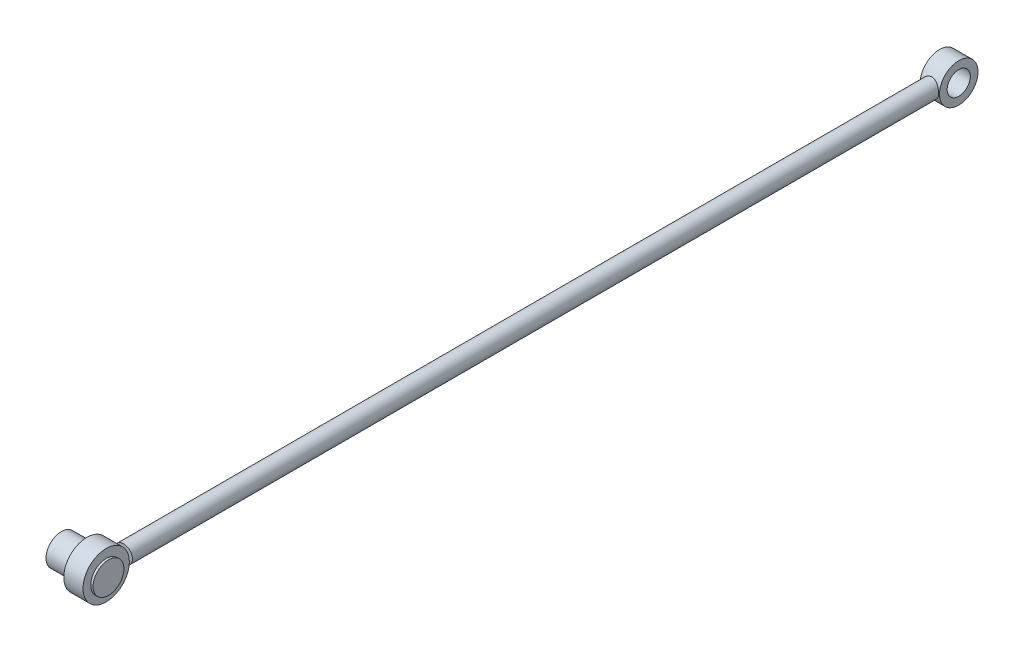
ISO-10303-21;
HEADER;
FILE_DESCRIPTION(('STEP AP214'),'2;1');
FILE_NAME('part.step','',(''),(''),'','','');
FILE_SCHEMA(('AUTOMOTIVE_DESIGN { 1 0 10303 214 1 1 1 1 }'));
ENDSEC;
DATA;
#1=APPLICATION_CONTEXT('core data for automotive mechanical design processes');
#2=APPLICATION_PROTOCOL_DEFINITION('international standard','automotive_design',2000,#1);
#3=PRODUCT_CONTEXT('',#1,'mechanical');
#4=PRODUCT('Part','Part','',(#3));
#5=PRODUCT_RELATED_PRODUCT_CATEGORY('part','',(#4));
#6=PRODUCT_DEFINITION_FORMATION('','',#4);
#7=PRODUCT_DEFINITION_CONTEXT('part definition',#1,'design');
#8=PRODUCT_DEFINITION('design','',#6,#7);
#9=PRODUCT_DEFINITION_SHAPE('','',#8);
#10=(LENGTH_UNIT() NAMED_UNIT(*) SI_UNIT(.MILLI.,.METRE.));
#11=(NAMED_UNIT(*) PLANE_ANGLE_UNIT() SI_UNIT($,.RADIAN.));
#12=(NAMED_UNIT(*) SI_UNIT($,.STERADIAN.) SOLID_ANGLE_UNIT());
#13=UNCERTAINTY_MEASURE_WITH_UNIT(LENGTH_MEASURE(1.E-05),#10,'distance_accuracy_value','');
#14=(GEOMETRIC_REPRESENTATION_CONTEXT(3) GLOBAL_UNCERTAINTY_ASSIGNED_CONTEXT((#13)) GLOBAL_UNIT_ASSIGNED_CONTEXT((#10,
#11,#12)) REPRESENTATION_CONTEXT('',''));
#15=CARTESIAN_POINT('',(0.,0.,0.));
#16=DIRECTION('',(0.,0.,1.));
#17=DIRECTION('',(1.,0.,0.));
#18=AXIS2_PLACEMENT_3D('',#15,#16,#17);
#19=CARTESIAN_POINT('',(1.24999999999999,0.,0.));
#20=DIRECTION('',(1.,0.,0.));
#21=DIRECTION('',(0.,0.,-1.));
#22=AXIS2_PLACEMENT_3D('',#19,#20,#21);
#23=PLANE('',#22);
#24=CARTESIAN_POINT('',(1.24999999999999,-0.128144949894505,56.));
#25=DIRECTION('',(1.,0.,0.));
#26=DIRECTION('',(0.,0.,-1.));
#27=AXIS2_PLACEMENT_3D('',#24,#25,#26);
#28=CIRCLE('',#27,2.);
#29=CARTESIAN_POINT('',(1.24999999999999,-0.128144949894505,54.));
#30=VERTEX_POINT('',#29);
#31=EDGE_CURVE('E13',#30,#30,#28,.T.);
#32=ORIENTED_EDGE('',*,*,#31,.F.);
#33=EDGE_LOOP('',(#32));
#34=FACE_BOUND('',#33,.T.);
#35=CARTESIAN_POINT('',(1.24999999999999,0.,56.));
#36=DIRECTION('',(-1.,0.,0.));
#37=DIRECTION('',(0.,0.,1.));
#38=AXIS2_PLACEMENT_3D('',#35,#36,#37);
#39=CIRCLE('',#38,3.);
#40=CARTESIAN_POINT('',(1.24999999999999,0.,59.));
#41=VERTEX_POINT('',#40);
#42=EDGE_CURVE('E64',#41,#41,#39,.T.);
#43=ORIENTED_EDGE('',*,*,#42,.F.);
#44=EDGE_LOOP('',(#43));
#45=FACE_BOUND('',#44,.T.);
#46=ADVANCED_FACE('F61',(#34,#45),#23,.T.);
#47=CARTESIAN_POINT('',(-1.25000000000001,0.,56.));
#48=DIRECTION('',(-1.,0.,0.));
#49=DIRECTION('',(0.,0.,1.));
#50=AXIS2_PLACEMENT_3D('',#47,#48,#49);
#51=CYLINDRICAL_SURFACE('',#50,3.);
#52=ORIENTED_EDGE('',*,*,#42,.T.);
#53=EDGE_LOOP('',(#52));
#54=FACE_BOUND('',#53,.T.);
#55=CARTESIAN_POINT('',(-1.25000000000001,0.,56.));
#56=DIRECTION('',(-1.,0.,0.));
#57=DIRECTION('',(0.,0.,1.));
#58=AXIS2_PLACEMENT_3D('',#55,#56,#57);
#59=CIRCLE('',#58,3.);
#60=CARTESIAN_POINT('',(-1.25000000000001,0.,59.));
#61=VERTEX_POINT('',#60);
#62=EDGE_CURVE('E79',#61,#61,#59,.T.);
#63=ORIENTED_EDGE('',*,*,#62,.F.);
#64=EDGE_LOOP('',(#63));
#65=FACE_BOUND('',#64,.T.);
#66=ADVANCED_FACE('F86',(#54,#65),#51,.T.);
#67=CARTESIAN_POINT('',(-1.25000000000001,0.,0.));
#68=DIRECTION('',(1.,0.,0.));
#69=DIRECTION('',(0.,0.,-1.));
#70=AXIS2_PLACEMENT_3D('',#67,#68,#69);
#71=PLANE('',#70);
#72=CARTESIAN_POINT('',(-1.25000000000001,0.,56.));
#73=DIRECTION('',(-1.,0.,0.));
#74=DIRECTION('',(0.,0.,1.));
#75=AXIS2_PLACEMENT_3D('',#72,#73,#74);
#76=CIRCLE('',#75,2.);
#77=CARTESIAN_POINT('',(-1.25000000000001,0.,58.));
#78=VERTEX_POINT('',#77);
#79=EDGE_CURVE('E68',#78,#78,#76,.T.);
#80=ORIENTED_EDGE('',*,*,#79,.F.);
#81=EDGE_LOOP('',(#80));
#82=FACE_BOUND('',#81,.T.);
#83=ORIENTED_EDGE('',*,*,#62,.T.);
#84=EDGE_LOOP('',(#83));
#85=FACE_BOUND('',#84,.T.);
#86=ADVANCED_FACE('F96',(#82,#85),#71,.F.);
#87=CARTESIAN_POINT('',(-4.55000000000001,0.,56.));
#88=DIRECTION('',(1.,0.,0.));
#89=DIRECTION('',(0.,0.,-1.));
#90=AXIS2_PLACEMENT_3D('',#87,#88,#89);
#91=CYLINDRICAL_SURFACE('',#90,2.);
#92=CARTESIAN_POINT('',(-4.55000000000001,0.,56.));
#93=DIRECTION('',(-1.,0.,0.));
#94=DIRECTION('',(0.,0.,1.));
#95=AXIS2_PLACEMENT_3D('',#92,#93,#94);
#96=CIRCLE('',#95,2.);
#97=CARTESIAN_POINT('',(-4.55000000000001,0.,58.));
#98=VERTEX_POINT('',#97);
#99=EDGE_CURVE('E77',#98,#98,#96,.T.);
#100=ORIENTED_EDGE('',*,*,#99,.F.);
#101=EDGE_LOOP('',(#100));
#102=FACE_BOUND('',#101,.T.);
#103=ORIENTED_EDGE('',*,*,#79,.T.);
#104=EDGE_LOOP('',(#103));
#105=FACE_BOUND('',#104,.T.);
#106=ADVANCED_FACE('F100',(#102,#105),#91,.T.);
#107=CARTESIAN_POINT('',(-4.55000000000001,0.,56.));
#108=DIRECTION('',(-1.,0.,0.));
#109=DIRECTION('',(0.,0.,1.));
#110=AXIS2_PLACEMENT_3D('',#107,#108,#109);
#111=PLANE('',#110);
#112=ORIENTED_EDGE('',*,*,#99,.T.);
#113=EDGE_LOOP('',(#112));
#114=FACE_BOUND('',#113,.T.);
#115=ADVANCED_FACE('F106',(#114),#111,.T.);
#116=CARTESIAN_POINT('',(1.54999999999999,-0.128144949894505,56.));
#117=DIRECTION('',(-1.,0.,0.));
#118=DIRECTION('',(0.,0.,1.));
#119=AXIS2_PLACEMENT_3D('',#116,#117,#118);
#120=CYLINDRICAL_SURFACE('',#119,2.);
#121=CARTESIAN_POINT('',(1.54999999999999,-0.128144949894505,56.));
#122=DIRECTION('',(1.,0.,0.));
#123=DIRECTION('',(0.,0.,-1.));
#124=AXIS2_PLACEMENT_3D('',#121,#122,#123);
#125=CIRCLE('',#124,2.);
#126=CARTESIAN_POINT('',(1.54999999999999,-0.128144949894505,54.));
#127=VERTEX_POINT('',#126);
#128=EDGE_CURVE('E76',#127,#127,#125,.T.);
#129=ORIENTED_EDGE('',*,*,#128,.F.);
#130=EDGE_LOOP('',(#129));
#131=FACE_BOUND('',#130,.T.);
#132=ORIENTED_EDGE('',*,*,#31,.T.);
#133=EDGE_LOOP('',(#132));
#134=FACE_BOUND('',#133,.T.);
#135=ADVANCED_FACE('F109',(#131,#134),#120,.T.);
#136=CARTESIAN_POINT('',(1.54999999999999,-0.128144949894505,56.));
#137=DIRECTION('',(1.,0.,0.));
#138=DIRECTION('',(0.,0.,-1.));
#139=AXIS2_PLACEMENT_3D('',#136,#137,#138);
#140=PLANE('',#139);
#141=ORIENTED_EDGE('',*,*,#128,.T.);
#142=EDGE_LOOP('',(#141));
#143=FACE_BOUND('',#142,.T.);
#144=ADVANCED_FACE('F112',(#143),#140,.T.);
#145=CLOSED_SHELL('',(#46,#66,#86,#106,#115,#135,#144));
#146=MANIFOLD_SOLID_BREP('B2',#145);
#147=CARTESIAN_POINT('',(-2.67659003472271,0.,-54.5));
#148=DIRECTION('',(-1.,0.,0.));
#149=DIRECTION('',(0.,0.,1.));
#150=AXIS2_PLACEMENT_3D('',#147,#148,#149);
#151=CYLINDRICAL_SURFACE('',#150,2.5);
#152=CARTESIAN_POINT('',(1.24999999999999,0.,-54.5));
#153=DIRECTION('',(-1.,0.,0.));
#154=DIRECTION('',(0.,0.,1.));
#155=AXIS2_PLACEMENT_3D('',#152,#153,#154);
#156=CIRCLE('',#155,2.5);
#157=CARTESIAN_POINT('',(1.24999999999999,0.,-52.));
#158=VERTEX_POINT('',#157);
#159=EDGE_CURVE('E188',#158,#158,#156,.T.);
#160=ORIENTED_EDGE('',*,*,#159,.T.);
#161=EDGE_LOOP('',(#160));
#162=FACE_BOUND('',#161,.T.);
#163=CARTESIAN_POINT('',(-1.25000000000001,0.,-54.5));
#164=DIRECTION('',(-1.,0.,0.));
#165=DIRECTION('',(0.,0.,1.));
#166=AXIS2_PLACEMENT_3D('',#163,#164,#165);
#167=CIRCLE('',#166,2.5);
#168=CARTESIAN_POINT('',(-1.25000000000001,0.,-52.));
#169=VERTEX_POINT('',#168);
#170=EDGE_CURVE('E184',#169,#169,#167,.T.);
#171=ORIENTED_EDGE('',*,*,#170,.F.);
#172=EDGE_LOOP('',(#171));
#173=FACE_BOUND('',#172,.T.);
#174=CARTESIAN_POINT('',(-1.15,0.,-52.));
#175=CARTESIAN_POINT('',(-1.14999680085672,-0.0610221164421327,-52.000002666765));
#176=CARTESIAN_POINT('',(-1.14511438468194,-0.122133602234696,-52.0022589365363));
#177=CARTESIAN_POINT('',(-1.12578408759951,-0.242585724274824,-52.0110608165383));
#178=CARTESIAN_POINT('',(-1.1113144593065,-0.30192201313999,-52.0176161783731));
#179=CARTESIAN_POINT('',(-1.07347537258062,-0.416891902761806,-52.0343229289961));
#180=CARTESIAN_POINT('',(-1.0501385142006,-0.472538199826034,-52.0444611361487));
#181=CARTESIAN_POINT('',(-0.995379061951152,-0.579059558054782,-52.0673753892748));
#182=CARTESIAN_POINT('',(-0.963957969743383,-0.629935502929074,-52.0801509452689));
#183=CARTESIAN_POINT('',(-0.891992942753149,-0.728540239687653,-52.1079314703465));
#184=CARTESIAN_POINT('',(-0.851050642634139,-0.775954698633466,-52.1230191803576));
#185=CARTESIAN_POINT('',(-0.762053881626836,-0.863525035277654,-52.1534115963217));
#186=CARTESIAN_POINT('',(-0.713994910902616,-0.903676274164433,-52.168716434267));
#187=CARTESIAN_POINT('',(-0.608482683618005,-0.978096362346193,-52.1989042682043));
#188=CARTESIAN_POINT('',(-0.550628623653581,-1.0118362114668,-52.2137001474002));
#189=CARTESIAN_POINT('',(-0.429298304202954,-1.06896729306594,-52.2398444458014));
#190=CARTESIAN_POINT('',(-0.36582557224461,-1.09236496405849,-52.2511950085024));
#191=CARTESIAN_POINT('',(-0.238659144977491,-1.12678178567324,-52.2682482909705));
#192=CARTESIAN_POINT('',(-0.175168948475132,-1.13841007873844,-52.2742269036183));
#193=CARTESIAN_POINT('',(-0.0468794048390744,-1.15084625008846,-52.2806290657944));
#194=CARTESIAN_POINT('',(0.0179189321620603,-1.15166217987055,-52.2810567488538));
#195=CARTESIAN_POINT('',(0.140230440873755,-1.14290244196327,-52.2765368058895));
#196=CARTESIAN_POINT('',(0.197838904365184,-1.13433032528635,-52.272108238025));
#197=CARTESIAN_POINT('',(0.310684166786622,-1.10874887233228,-52.2592682914526));
#198=CARTESIAN_POINT('',(0.365920376996089,-1.09173745467631,-52.2508559302478));
#199=CARTESIAN_POINT('',(0.473975212565101,-1.04942513434305,-52.230801135829));
#200=CARTESIAN_POINT('',(0.526709456981898,-1.02394324474928,-52.2190891156949));
#201=CARTESIAN_POINT('',(0.627385660423913,-0.965545247982676,-52.1937619292328));
#202=CARTESIAN_POINT('',(0.675325532416868,-0.932625923375899,-52.1801459402223));
#203=CARTESIAN_POINT('',(0.770358902789346,-0.856237788024085,-52.1508089023228));
#204=CARTESIAN_POINT('',(0.816833394112794,-0.812023684477652,-52.1350170492808));
#205=CARTESIAN_POINT('',(0.90194133687937,-0.716313132069732,-52.1042911338125));
#206=CARTESIAN_POINT('',(0.940572075234533,-0.664814173853318,-52.0893573694681));
#207=CARTESIAN_POINT('',(1.01008908112145,-0.553761033938336,-52.0614078739643));
#208=CARTESIAN_POINT('',(1.04067045248726,-0.493993862575749,-52.0484737505294));
#209=CARTESIAN_POINT('',(1.09111856945803,-0.369415412363431,-52.0266379827281));
#210=CARTESIAN_POINT('',(1.11099255236712,-0.304607574576102,-52.0177336152349));
#211=CARTESIAN_POINT('',(1.13804370241597,-0.176911532685541,-52.0055040783636));
#212=CARTESIAN_POINT('',(1.14604816002009,-0.11423346499986,-52.0018163130541));
#213=CARTESIAN_POINT('',(1.15166415718688,0.0116756267784259,-51.999235608212));
#214=CARTESIAN_POINT('',(1.14927957245369,0.0749064358829793,-52.0003408806026));
#215=CARTESIAN_POINT('',(1.13472588854476,0.195896660750884,-52.0069964663412));
#216=CARTESIAN_POINT('',(1.12318473531876,0.253749299539136,-52.0122614201795));
#217=CARTESIAN_POINT('',(1.09157436461664,0.366607154128703,-52.0263720471876));
#218=CARTESIAN_POINT('',(1.0715041371748,0.421612031848305,-52.0352181444107));
#219=CARTESIAN_POINT('',(1.02278667428463,0.529150457858727,-52.0560087289794));
#220=CARTESIAN_POINT('',(0.993893746764701,0.581555262231183,-52.0680404496421));
#221=CARTESIAN_POINT('',(0.928619088747682,0.680959846725025,-52.0939790208981));
#222=CARTESIAN_POINT('',(0.892234068420063,0.727957238233888,-52.107886694307));
#223=CARTESIAN_POINT('',(0.809386059775389,0.81946466792808,-52.137589033572));
#224=CARTESIAN_POINT('',(0.762326755580171,0.863416742649005,-52.1534432875488));
#225=CARTESIAN_POINT('',(0.661344100404595,0.94300549353514,-52.184278437436));
#226=CARTESIAN_POINT('',(0.60741775412467,0.978638521725544,-52.1992589480504));
#227=CARTESIAN_POINT('',(0.492126592699997,1.04151139957948,-52.2270122089294));
#228=CARTESIAN_POINT('',(0.43058885067794,1.06847160006055,-52.2397064868555));
#229=CARTESIAN_POINT('',(0.303070653636758,1.11137787962301,-52.2604872701905));
#230=CARTESIAN_POINT('',(0.237095026927362,1.12733572289275,-52.2685786955403));
#231=CARTESIAN_POINT('',(0.108863094637529,1.14650438487335,-52.2783715440814));
#232=CARTESIAN_POINT('',(0.0467953894374937,1.15071960292076,-52.2805757446969));
#233=CARTESIAN_POINT('',(-0.0771622096268085,1.14907992262834,-52.2797258261694));
#234=CARTESIAN_POINT('',(-0.139052145279863,1.14322762520174,-52.276673065147));
#235=CARTESIAN_POINT('',(-0.256447839565854,1.12251663487283,-52.2661524208123));
#236=CARTESIAN_POINT('',(-0.312099663521724,1.10830626448546,-52.259003231416));
#237=CARTESIAN_POINT('',(-0.420209118905766,1.07199734932819,-52.2414105486326));
#238=CARTESIAN_POINT('',(-0.472665803150068,1.04989647865171,-52.2309660839929));
#239=CARTESIAN_POINT('',(-0.57668011844881,0.99678060130044,-52.2071137104099));
#240=CARTESIAN_POINT('',(-0.627952240665216,0.965275324597976,-52.1935561840935));
#241=CARTESIAN_POINT('',(-0.724792057417062,0.894854473756866,-52.1653321891056));
#242=CARTESIAN_POINT('',(-0.770357151995548,0.855935542377582,-52.1506652198492));
#243=CARTESIAN_POINT('',(-0.859035182081372,0.767367732153718,-52.1201800559744));
#244=CARTESIAN_POINT('',(-0.901488483932116,0.717046212748816,-52.1043871545817));
#245=CARTESIAN_POINT('',(-0.977439136512883,0.609464622140747,-52.0747862560356));
#246=CARTESIAN_POINT('',(-1.01093229398904,0.552201320408678,-52.0609791896249));
#247=CARTESIAN_POINT('',(-1.06757523739849,0.432586304184508,-52.0369606782327));
#248=CARTESIAN_POINT('',(-1.0907988596119,0.370274855525814,-52.0267236815512));
#249=CARTESIAN_POINT('',(-1.12617254126555,0.242128552488221,-52.0109218140429));
#250=CARTESIAN_POINT('',(-1.13835581437739,0.176304901150819,-52.0053429337948));
#251=CARTESIAN_POINT('',(-1.14648888595882,0.0916645825875702,-52.0016132160943));
#252=CARTESIAN_POINT('',(-1.14780418805331,0.0733641271700347,-52.0010094154064));
#253=CARTESIAN_POINT('',(-1.14956023398603,0.0367118118168692,-52.0002024026786));
#254=CARTESIAN_POINT('',(-1.15000096253813,0.0183599509883696,-51.9999991976405));
#255=CARTESIAN_POINT('',(-1.15,0.,-52.));
#256=B_SPLINE_CURVE_WITH_KNOTS('',3,(#174,#175,#176,#177,#178,#179,#180,#181,#182,#183,#184,
#185,#186,#187,#188,#189,#190,#191,#192,#193,#194,#195,#196,#197,#198,#199,#200,#201,#202,#203,
#204,#205,#206,#207,#208,#209,#210,#211,#212,#213,#214,#215,#216,#217,#218,#219,#220,#221,#222,
#223,#224,#225,#226,#227,#228,#229,#230,#231,#232,#233,#234,#235,#236,#237,#238,#239,#240,#241,
#242,#243,#244,#245,#246,#247,#248,#249,#250,#251,#252,#253,#254,#255),.UNSPECIFIED.,.T.,.F.,(4,
2,2,2,2,2,2,2,2,2,2,2,2,2,2,2,2,2,2,2,2,2,2,2,2,2,2,2,2,2,2,2,2,2,2,2,2,2,2,2,4),(0.,
0.182991184318566,0.366398888774783,0.549138725346493,0.731844642124993,0.92433256701881,
1.11694299773464,1.32167114547342,1.52627165975279,1.71963788525092,1.91286011122177,
2.08727854371261,2.26174001429955,2.44019847999677,2.61873429514118,2.81604254018051,
3.01341891665008,3.21744754373153,3.4213380908622,3.61021266528953,3.79901678478451,
3.97588773452364,4.15277963417946,4.33513329320142,4.51756719640664,4.7156292021259,
4.91377789731998,5.11779162152826,5.32158686586735,5.5073200700012,5.69300529770972,
5.865896817358,6.03883934289628,6.22314446515028,6.40753324843077,6.60969400762341,
6.81194921108578,7.01272560105066,7.21289595261076,7.26795222811409,7.32300946590391),.UNSPECIFIED.);
#257=CARTESIAN_POINT('',(-1.15,0.,-52.));
#258=VERTEX_POINT('',#257);
#259=EDGE_CURVE('E173',#258,#258,#256,.T.);
#260=ORIENTED_EDGE('',*,*,#259,.F.);
#261=EDGE_LOOP('',(#260));
#262=FACE_BOUND('',#261,.T.);
#263=ADVANCED_FACE('F168',(#162,#173,#262),#151,.T.);
#264=CARTESIAN_POINT('',(-1.25000000000001,0.,-53.));
#265=DIRECTION('',(-1.,0.,0.));
#266=DIRECTION('',(0.,0.,1.));
#267=AXIS2_PLACEMENT_3D('',#264,#265,#266);
#268=PLANE('',#267);
#269=ORIENTED_EDGE('',*,*,#170,.T.);
#270=EDGE_LOOP('',(#269));
#271=FACE_BOUND('',#270,.T.);
#272=CARTESIAN_POINT('',(-1.25000000000001,0.,-54.5));
#273=DIRECTION('',(-1.,0.,0.));
#274=DIRECTION('',(0.,0.,1.));
#275=AXIS2_PLACEMENT_3D('',#272,#273,#274);
#276=CIRCLE('',#275,1.5);
#277=CARTESIAN_POINT('',(-1.25000000000001,0.,-53.));
#278=VERTEX_POINT('',#277);
#279=EDGE_CURVE('E194',#278,#278,#276,.T.);
#280=ORIENTED_EDGE('',*,*,#279,.F.);
#281=EDGE_LOOP('',(#280));
#282=FACE_BOUND('',#281,.T.);
#283=ADVANCED_FACE('F201',(#271,#282),#268,.T.);
#284=CARTESIAN_POINT('',(1.24999999999999,0.,-53.));
#285=DIRECTION('',(1.,0.,0.));
#286=DIRECTION('',(0.,0.,-1.));
#287=AXIS2_PLACEMENT_3D('',#284,#285,#286);
#288=PLANE('',#287);
#289=CARTESIAN_POINT('',(1.24999999999999,0.,-54.5));
#290=DIRECTION('',(-1.,0.,0.));
#291=DIRECTION('',(0.,0.,1.));
#292=AXIS2_PLACEMENT_3D('',#289,#290,#291);
#293=CIRCLE('',#292,1.5);
#294=CARTESIAN_POINT('',(1.24999999999999,0.,-53.));
#295=VERTEX_POINT('',#294);
#296=EDGE_CURVE('E191',#295,#295,#293,.T.);
#297=ORIENTED_EDGE('',*,*,#296,.T.);
#298=EDGE_LOOP('',(#297));
#299=FACE_BOUND('',#298,.T.);
#300=ORIENTED_EDGE('',*,*,#159,.F.);
#301=EDGE_LOOP('',(#300));
#302=FACE_BOUND('',#301,.T.);
#303=ADVANCED_FACE('F203',(#299,#302),#288,.T.);
#304=CARTESIAN_POINT('',(-2.67659003472271,0.,-54.5));
#305=DIRECTION('',(-1.,0.,0.));
#306=DIRECTION('',(0.,0.,1.));
#307=AXIS2_PLACEMENT_3D('',#304,#305,#306);
#308=CYLINDRICAL_SURFACE('',#307,1.5);
#309=ORIENTED_EDGE('',*,*,#279,.T.);
#310=EDGE_LOOP('',(#309));
#311=FACE_BOUND('',#310,.T.);
#312=ORIENTED_EDGE('',*,*,#296,.F.);
#313=EDGE_LOOP('',(#312));
#314=FACE_BOUND('',#313,.T.);
#315=ADVANCED_FACE('F198',(#311,#314),#308,.F.);
#316=CARTESIAN_POINT('',(0.,0.,52.5));
#317=DIRECTION('',(0.,0.,-1.));
#318=DIRECTION('',(-1.,0.,0.));
#319=AXIS2_PLACEMENT_3D('',#316,#317,#318);
#320=CYLINDRICAL_SURFACE('',#319,1.15);
#321=ORIENTED_EDGE('',*,*,#259,.T.);
#322=EDGE_LOOP('',(#321));
#323=FACE_BOUND('',#322,.T.);
#324=CARTESIAN_POINT('',(0.,0.,52.5));
#325=DIRECTION('',(0.,0.,1.));
#326=DIRECTION('',(1.,0.,0.));
#327=AXIS2_PLACEMENT_3D('',#324,#325,#326);
#328=CIRCLE('',#327,1.15);
#329=CARTESIAN_POINT('',(1.15,0.,52.5));
#330=VERTEX_POINT('',#329);
#331=EDGE_CURVE('E60',#330,#330,#328,.T.);
#332=ORIENTED_EDGE('',*,*,#331,.F.);
#333=EDGE_LOOP('',(#332));
#334=FACE_BOUND('',#333,.T.);
#335=ADVANCED_FACE('F170',(#323,#334),#320,.T.);
#336=CARTESIAN_POINT('',(0.,0.,52.5));
#337=DIRECTION('',(0.,0.,1.));
#338=DIRECTION('',(1.,0.,0.));
#339=AXIS2_PLACEMENT_3D('',#336,#337,#338);
#340=PLANE('',#339);
#341=ORIENTED_EDGE('',*,*,#331,.T.);
#342=EDGE_LOOP('',(#341));
#343=FACE_BOUND('',#342,.T.);
#344=ADVANCED_FACE('F214',(#343),#340,.T.);
#345=CLOSED_SHELL('',(#263,#283,#303,#315,#335,#344));
#346=MANIFOLD_SOLID_BREP('B8',#345);
#347=ADVANCED_BREP_SHAPE_REPRESENTATION('',(#18,#146,#346),#14);
#348=SHAPE_DEFINITION_REPRESENTATION(#9,#347);
ENDSEC;
END-ISO-10303-21;
